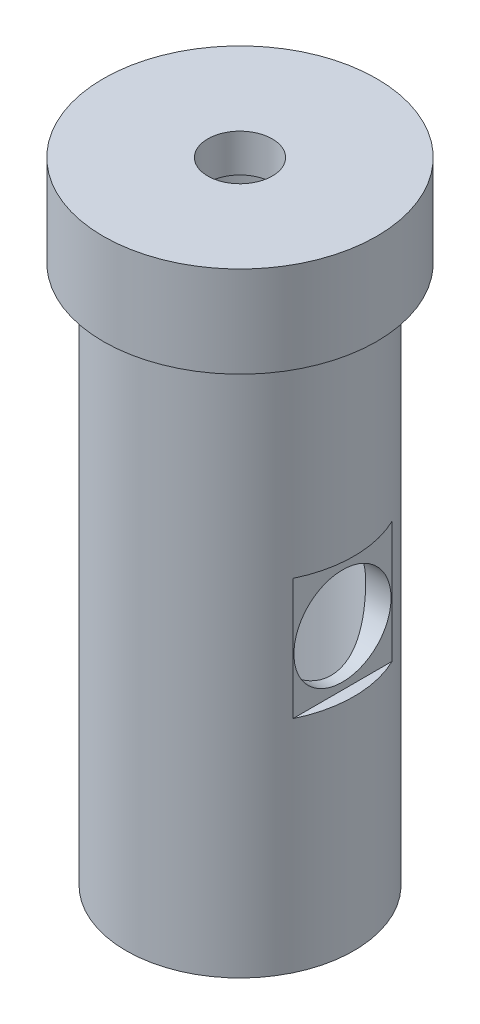
ISO-10303-21;
HEADER;
FILE_DESCRIPTION(('STEP AP214'),'2;1');
FILE_NAME('part.step','',(''),(''),'','','');
FILE_SCHEMA(('AUTOMOTIVE_DESIGN { 1 0 10303 214 1 1 1 1 }'));
ENDSEC;
DATA;
#1=APPLICATION_CONTEXT('core data for automotive mechanical design processes');
#2=APPLICATION_PROTOCOL_DEFINITION('international standard','automotive_design',2000,#1);
#3=PRODUCT_CONTEXT('',#1,'mechanical');
#4=PRODUCT('Part','Part','',(#3));
#5=PRODUCT_RELATED_PRODUCT_CATEGORY('part','',(#4));
#6=PRODUCT_DEFINITION_FORMATION('','',#4);
#7=PRODUCT_DEFINITION_CONTEXT('part definition',#1,'design');
#8=PRODUCT_DEFINITION('design','',#6,#7);
#9=PRODUCT_DEFINITION_SHAPE('','',#8);
#10=(LENGTH_UNIT() NAMED_UNIT(*) SI_UNIT(.MILLI.,.METRE.));
#11=(NAMED_UNIT(*) PLANE_ANGLE_UNIT() SI_UNIT($,.RADIAN.));
#12=(NAMED_UNIT(*) SI_UNIT($,.STERADIAN.) SOLID_ANGLE_UNIT());
#13=UNCERTAINTY_MEASURE_WITH_UNIT(LENGTH_MEASURE(1.E-05),#10,'distance_accuracy_value','');
#14=(GEOMETRIC_REPRESENTATION_CONTEXT(3) GLOBAL_UNCERTAINTY_ASSIGNED_CONTEXT((#13)) GLOBAL_UNIT_ASSIGNED_CONTEXT((#10,
#11,#12)) REPRESENTATION_CONTEXT('',''));
#15=CARTESIAN_POINT('',(0.,0.,0.));
#16=DIRECTION('',(0.,0.,1.));
#17=DIRECTION('',(1.,0.,0.));
#18=AXIS2_PLACEMENT_3D('',#15,#16,#17);
#19=CARTESIAN_POINT('',(0.,0.,0.));
#20=DIRECTION('',(0.,-1.,0.));
#21=DIRECTION('',(0.,0.,-1.));
#22=AXIS2_PLACEMENT_3D('',#19,#20,#21);
#23=CYLINDRICAL_SURFACE('',#22,15.);
#24=DIRECTION('',(0.,-1.,0.));
#25=VECTOR('',#24,1.);
#26=CARTESIAN_POINT('',(13.5,0.,6.53834841531101));
#27=LINE('',#26,#25);
#28=CARTESIAN_POINT('',(13.5,29.,6.53834841531101));
#29=VERTEX_POINT('',#28);
#30=CARTESIAN_POINT('',(13.5,45.,6.53834841531101));
#31=VERTEX_POINT('',#30);
#32=EDGE_CURVE('E48',#29,#31,#27,.F.);
#33=ORIENTED_EDGE('',*,*,#32,.T.);
#34=CARTESIAN_POINT('',(0.,45.,0.));
#35=DIRECTION('',(0.,1.,0.));
#36=DIRECTION('',(0.,0.,1.));
#37=AXIS2_PLACEMENT_3D('',#34,#35,#36);
#38=CIRCLE('',#37,15.);
#39=CARTESIAN_POINT('',(13.5,45.,-6.53834841531101));
#40=VERTEX_POINT('',#39);
#41=EDGE_CURVE('E54',#31,#40,#38,.T.);
#42=ORIENTED_EDGE('',*,*,#41,.T.);
#43=DIRECTION('',(0.,-1.,0.));
#44=VECTOR('',#43,1.);
#45=CARTESIAN_POINT('',(13.5,0.,-6.53834841531101));
#46=LINE('',#45,#44);
#47=CARTESIAN_POINT('',(13.5,29.,-6.53834841531101));
#48=VERTEX_POINT('',#47);
#49=EDGE_CURVE('E11',#40,#48,#46,.T.);
#50=ORIENTED_EDGE('',*,*,#49,.T.);
#51=CARTESIAN_POINT('',(0.,29.,0.));
#52=DIRECTION('',(0.,-1.,0.));
#53=DIRECTION('',(0.,0.,-1.));
#54=AXIS2_PLACEMENT_3D('',#51,#52,#53);
#55=CIRCLE('',#54,15.);
#56=EDGE_CURVE('E61',#48,#29,#55,.T.);
#57=ORIENTED_EDGE('',*,*,#56,.T.);
#58=EDGE_LOOP('',(#33,#42,#50,#57));
#59=FACE_BOUND('',#58,.T.);
#60=CARTESIAN_POINT('',(0.,0.,0.));
#61=DIRECTION('',(0.,-1.,0.));
#62=DIRECTION('',(0.,0.,-1.));
#63=AXIS2_PLACEMENT_3D('',#60,#61,#62);
#64=CIRCLE('',#63,15.);
#65=CARTESIAN_POINT('',(0.,0.,-15.));
#66=VERTEX_POINT('',#65);
#67=EDGE_CURVE('E80',#66,#66,#64,.T.);
#68=ORIENTED_EDGE('',*,*,#67,.F.);
#69=EDGE_LOOP('',(#68));
#70=FACE_BOUND('',#69,.T.);
#71=CARTESIAN_POINT('',(0.,71.,0.));
#72=DIRECTION('',(0.,-1.,0.));
#73=DIRECTION('',(0.,0.,-1.));
#74=AXIS2_PLACEMENT_3D('',#71,#72,#73);
#75=CIRCLE('',#74,15.);
#76=CARTESIAN_POINT('',(0.,71.,-15.));
#77=VERTEX_POINT('',#76);
#78=EDGE_CURVE('E75',#77,#77,#75,.T.);
#79=ORIENTED_EDGE('',*,*,#78,.T.);
#80=EDGE_LOOP('',(#79));
#81=FACE_BOUND('',#80,.T.);
#82=ADVANCED_FACE('F35',(#59,#70,#81),#23,.T.);
#83=CARTESIAN_POINT('',(-12.,0.,0.));
#84=DIRECTION('',(0.,1.,0.));
#85=DIRECTION('',(0.,0.,1.));
#86=AXIS2_PLACEMENT_3D('',#83,#84,#85);
#87=PLANE('',#86);
#88=CARTESIAN_POINT('',(0.,0.,0.));
#89=DIRECTION('',(0.,-1.,0.));
#90=DIRECTION('',(0.,0.,-1.));
#91=AXIS2_PLACEMENT_3D('',#88,#89,#90);
#92=CIRCLE('',#91,12.);
#93=CARTESIAN_POINT('',(0.,0.,-12.));
#94=VERTEX_POINT('',#93);
#95=EDGE_CURVE('E85',#94,#94,#92,.T.);
#96=ORIENTED_EDGE('',*,*,#95,.F.);
#97=EDGE_LOOP('',(#96));
#98=FACE_BOUND('',#97,.T.);
#99=ORIENTED_EDGE('',*,*,#67,.T.);
#100=EDGE_LOOP('',(#99));
#101=FACE_BOUND('',#100,.T.);
#102=ADVANCED_FACE('F126',(#98,#101),#87,.F.);
#103=CARTESIAN_POINT('',(0.,0.,0.));
#104=DIRECTION('',(0.,-1.,0.));
#105=DIRECTION('',(0.,0.,-1.));
#106=AXIS2_PLACEMENT_3D('',#103,#104,#105);
#107=CYLINDRICAL_SURFACE('',#106,12.);
#108=CARTESIAN_POINT('',(10.1508620323596,36.304872912084,-6.4));
#109=CARTESIAN_POINT('',(10.1508612250914,36.469897504109,-6.40000065688965));
#110=CARTESIAN_POINT('',(10.1548995801997,36.6349146976354,-6.39360937735728));
#111=CARTESIAN_POINT('',(10.1708905563061,36.9636408427246,-6.36814032039505));
#112=CARTESIAN_POINT('',(10.1828461537594,37.1273492788303,-6.34905777172223));
#113=CARTESIAN_POINT('',(10.2142266842615,37.4523154338643,-6.29844868721064));
#114=CARTESIAN_POINT('',(10.2336614176776,37.6135696474503,-6.26690582241812));
#115=CARTESIAN_POINT('',(10.27928629531,37.9323341897322,-6.19178496487026));
#116=CARTESIAN_POINT('',(10.3054794308007,38.0898428268327,-6.1482016423929));
#117=CARTESIAN_POINT('',(10.3635337605768,38.3990919866616,-6.04982663745212));
#118=CARTESIAN_POINT('',(10.3953575590964,38.5508630033311,-5.99510856640759));
#119=CARTESIAN_POINT('',(10.4638063692647,38.8489475184621,-5.87482320315679));
#120=CARTESIAN_POINT('',(10.5004332524046,38.9952588609027,-5.80925167934712));
#121=CARTESIAN_POINT('',(10.6159594170568,39.4249057746003,-5.59708024168359));
#122=CARTESIAN_POINT('',(10.7005551194711,39.6992099989998,-5.43494113504599));
#123=CARTESIAN_POINT('',(10.8850113678262,40.2438335445333,-5.0561826941529));
#124=CARTESIAN_POINT('',(10.9855589057498,40.5113209702699,-4.83586048330807));
#125=CARTESIAN_POINT('',(11.1851266185705,41.0079308189542,-4.35438996273654));
#126=CARTESIAN_POINT('',(11.2841459069956,41.2370316826465,-4.09321886896503));
#127=CARTESIAN_POINT('',(11.4282331622978,41.5560080412895,-3.66345207893257));
#128=CARTESIAN_POINT('',(11.4771780357429,41.661472148767,-3.50748864979899));
#129=CARTESIAN_POINT('',(11.5705645914663,41.8587475514409,-3.18590808402808));
#130=CARTESIAN_POINT('',(11.6150082217947,41.9505647608618,-3.0202951728061));
#131=CARTESIAN_POINT('',(11.6981088389304,42.1196098112658,-2.68045678869551));
#132=CARTESIAN_POINT('',(11.7367675515266,42.1968420051409,-2.50623390509706));
#133=CARTESIAN_POINT('',(11.8071505477965,42.3358262571922,-2.1503657703769));
#134=CARTESIAN_POINT('',(11.8388756888084,42.397580229394,-1.9687214402199));
#135=CARTESIAN_POINT('',(11.8921913624827,42.5005160584395,-1.61410890684681));
#136=CARTESIAN_POINT('',(11.9143851139318,42.5429389333849,-1.44159120842384));
#137=CARTESIAN_POINT('',(11.9514181388681,42.6133827145314,-1.09285845564876));
#138=CARTESIAN_POINT('',(11.9662577676928,42.6414043165776,-0.916643580366252));
#139=CARTESIAN_POINT('',(11.9881422305233,42.6826357960508,-0.56211291162343));
#140=CARTESIAN_POINT('',(11.9951916694973,42.6958544239327,-0.383798422372006));
#141=CARTESIAN_POINT('',(12.0012999130492,42.7073119073134,-0.0265571917399795));
#142=CARTESIAN_POINT('',(12.0003592988281,42.7055518523698,0.152369504161967));
#143=CARTESIAN_POINT('',(11.9910073876503,42.6879992494952,0.491550524796921));
#144=CARTESIAN_POINT('',(11.9833444977043,42.6736123994837,0.65190064939119));
#145=CARTESIAN_POINT('',(11.961741939071,42.6328717643205,0.970700822351116));
#146=CARTESIAN_POINT('',(11.9478001706843,42.6065139759812,1.1291502168878));
#147=CARTESIAN_POINT('',(11.9139745254727,42.5421429510751,1.44295171693833));
#148=CARTESIAN_POINT('',(11.8940927273828,42.5041337918272,1.59830488573308));
#149=CARTESIAN_POINT('',(11.8488327847678,42.4168472211565,1.90504895488573));
#150=CARTESIAN_POINT('',(11.8234524987002,42.3675654188634,2.05643828559099));
#151=CARTESIAN_POINT('',(11.7674336081332,42.2575833388881,2.35605484315131));
#152=CARTESIAN_POINT('',(11.7367376192634,42.1967576716284,2.5042252998329));
#153=CARTESIAN_POINT('',(11.6709565212511,42.0646037043558,2.79481754278228));
#154=CARTESIAN_POINT('',(11.6358699379592,41.9932718754511,2.93723737692617));
#155=CARTESIAN_POINT('',(11.5251085338001,41.7643649291036,3.35479071442533));
#156=CARTESIAN_POINT('',(11.4438967294316,41.591810983248,3.62039977037581));
#157=CARTESIAN_POINT('',(11.2642109922092,41.1913544860926,4.14765061686134));
#158=CARTESIAN_POINT('',(11.1648203607104,40.9595704973323,4.40603262410673));
#159=CARTESIAN_POINT('',(11.0150671954878,40.5832984994847,4.76288240889726));
#160=CARTESIAN_POINT('',(10.964997352703,40.4529910702378,4.87679175917765));
#161=CARTESIAN_POINT('',(10.8658372059405,40.1832943276237,5.09389841082923));
#162=CARTESIAN_POINT('',(10.8167470697921,40.0439034753667,5.19709388936434));
#163=CARTESIAN_POINT('',(10.7170241524822,39.7452168818533,5.39992330399592));
#164=CARTESIAN_POINT('',(10.6665798465543,39.5852199970025,5.4986191554548));
#165=CARTESIAN_POINT('',(10.5700390498139,39.2562175847098,5.68198985534254));
#166=CARTESIAN_POINT('',(10.5239406019371,39.0872161664535,5.7666710280886));
#167=CARTESIAN_POINT('',(10.437795316616,38.7411858708389,5.92116997672586));
#168=CARTESIAN_POINT('',(10.3977445677745,38.5641622790528,5.99099737146532));
#169=CARTESIAN_POINT('',(10.3253251543256,38.2031812542986,6.11496732754637));
#170=CARTESIAN_POINT('',(10.292955306435,38.0192248944266,6.16911230513081));
#171=CARTESIAN_POINT('',(10.2396453161967,37.6610114523281,6.25716349682107));
#172=CARTESIAN_POINT('',(10.2179914613783,37.487176592708,6.29235433372183));
#173=CARTESIAN_POINT('',(10.1833623632681,37.1363313510391,6.34824541973308));
#174=CARTESIAN_POINT('',(10.1703865862252,36.9593211649787,6.36894656004588));
#175=CARTESIAN_POINT('',(10.1537152142986,36.6038993688814,6.39549177457663));
#176=CARTESIAN_POINT('',(10.1500119335191,36.4254890425561,6.4013481535447));
#177=CARTESIAN_POINT('',(10.1520400582479,36.0688659309078,6.39813171686178));
#178=CARTESIAN_POINT('',(10.1577705882457,35.8906531287895,6.38906028659528));
#179=CARTESIAN_POINT('',(10.1770157220294,35.5597483118679,6.35835031830109));
#180=CARTESIAN_POINT('',(10.1893934361313,35.4068150041871,6.33854405721524));
#181=CARTESIAN_POINT('',(10.2206079839979,35.1033694463928,6.28808819532854));
#182=CARTESIAN_POINT('',(10.2394469100334,34.9528579970748,6.25743508199548));
#183=CARTESIAN_POINT('',(10.2829774173042,34.6552382445092,6.18563928831834));
#184=CARTESIAN_POINT('',(10.3076685829289,34.5081297004103,6.14449735284688));
#185=CARTESIAN_POINT('',(10.3621647715794,34.2180596446234,6.0521410814271));
#186=CARTESIAN_POINT('',(10.3919718060067,34.0750997900162,6.00092278260139));
#187=CARTESIAN_POINT('',(10.4906601901279,33.6411498020771,5.8278821843193));
#188=CARTESIAN_POINT('',(10.5668071248644,33.3580988937423,5.68981407184234));
#189=CARTESIAN_POINT('',(10.7300580231156,32.8176384283455,5.37560660791392));
#190=CARTESIAN_POINT('',(10.8171675515448,32.5602420139761,5.19944788777101));
#191=CARTESIAN_POINT('',(11.0079204657883,32.0385379693822,4.78386368604374));
#192=CARTESIAN_POINT('',(11.1121103489288,31.7787888049724,4.53894255266014));
#193=CARTESIAN_POINT('',(11.3145547581155,31.3022998270758,4.00767619218196));
#194=CARTESIAN_POINT('',(11.4128063218878,31.0855813578565,3.72131052874482));
#195=CARTESIAN_POINT('',(11.5502260850635,30.7934805063793,3.25879803055501));
#196=CARTESIAN_POINT('',(11.5951678274334,30.7000928373758,3.09548754456879));
#197=CARTESIAN_POINT('',(11.6795248348019,30.5275917278327,2.76016626525693));
#198=CARTESIAN_POINT('',(11.7189427236407,30.4484715050731,2.58815965580278));
#199=CARTESIAN_POINT('',(11.7910726903845,30.3054392697624,2.23669011469273));
#200=CARTESIAN_POINT('',(11.8237883905604,30.241519039191,2.05723127409081));
#201=CARTESIAN_POINT('',(11.8815241258604,30.1296875952094,1.69218981530048));
#202=CARTESIAN_POINT('',(11.9065452263741,30.0817741654284,1.50660804883207));
#203=CARTESIAN_POINT('',(11.9460241801504,30.0065867698716,1.14956944347703));
#204=CARTESIAN_POINT('',(11.9612819843756,29.9777402473222,0.978530792880211));
#205=CARTESIAN_POINT('',(11.9844722003774,29.9340079600462,0.634186331980352));
#206=CARTESIAN_POINT('',(11.9924051058222,29.9191212544843,0.460880675262719));
#207=CARTESIAN_POINT('',(12.0007202472023,29.9035191816852,0.113519707574125));
#208=CARTESIAN_POINT('',(12.001105400952,29.9027983382002,-0.0605352876887117));
#209=CARTESIAN_POINT('',(11.9943212193508,29.915524629606,-0.407974381434417));
#210=CARTESIAN_POINT('',(11.9871521972515,29.9289711770126,-0.581358507437229));
#211=CARTESIAN_POINT('',(11.9663491772235,29.9681733817817,-0.91194903781048));
#212=CARTESIAN_POINT('',(11.9532893328298,29.9928372160424,-1.06932283598669));
#213=CARTESIAN_POINT('',(11.9212702225113,30.0536847399578,-1.38127016173427));
#214=CARTESIAN_POINT('',(11.9023089699704,30.0898723089913,-1.53584272774452));
#215=CARTESIAN_POINT('',(11.8589240842397,30.1733680883053,-1.84110911502455));
#216=CARTESIAN_POINT('',(11.8345021493361,30.2206728413463,-1.99180412601092));
#217=CARTESIAN_POINT('',(11.7807148683267,30.3259691206232,-2.2885609538468));
#218=CARTESIAN_POINT('',(11.7513475964537,30.383964810861,-2.43462093933314));
#219=CARTESIAN_POINT('',(11.6871085161947,30.5124881659141,-2.72665840594574));
#220=CARTESIAN_POINT('',(11.6520722461043,30.5834025867469,-2.87242959493254));
#221=CARTESIAN_POINT('',(11.5780952909795,30.7356088152358,-3.15743907873034));
#222=CARTESIAN_POINT('',(11.5391532815317,30.8169041455682,-3.29667513386084));
#223=CARTESIAN_POINT('',(11.4176707406926,31.0754887902486,-3.70361773993523));
#224=CARTESIAN_POINT('',(11.3304399563728,31.2675422907278,-3.96070637870421));
#225=CARTESIAN_POINT('',(11.1404737914043,31.7098414480907,-4.46893466599772));
#226=CARTESIAN_POINT('',(11.037089639134,31.9641696998957,-4.71628823700337));
#227=CARTESIAN_POINT('',(10.8846257336238,32.3740767468386,-5.05373796728043));
#228=CARTESIAN_POINT('',(10.8341946753662,32.5155913711086,-5.1607072612426));
#229=CARTESIAN_POINT('',(10.735547639971,32.8076063300257,-5.36289556501423));
#230=CARTESIAN_POINT('',(10.6873320238066,32.9581081198754,-5.45811266421064));
#231=CARTESIAN_POINT('',(10.5920308523556,33.2757967423899,-5.64092993424401));
#232=CARTESIAN_POINT('',(10.5451492013389,33.4434458395738,-5.72783469113695));
#233=CARTESIAN_POINT('',(10.457168040451,33.7869571306435,-5.88692619657516));
#234=CARTESIAN_POINT('',(10.4160655704201,33.962815057937,-5.95912048855699));
#235=CARTESIAN_POINT('',(10.3413819225489,34.3212369853789,-6.08780333312895));
#236=CARTESIAN_POINT('',(10.3077821301869,34.5037830505199,-6.14433084186479));
#237=CARTESIAN_POINT('',(10.2495202180428,34.874449218814,-6.24103633808767));
#238=CARTESIAN_POINT('',(10.2248521854518,35.0625655448949,-6.28122514393904));
#239=CARTESIAN_POINT('',(10.1873975950769,35.4258079509785,-6.341772539591));
#240=CARTESIAN_POINT('',(10.1737509048883,35.6006053390416,-6.36357442819393));
#241=CARTESIAN_POINT('',(10.1554833851298,35.9518955669149,-6.39268808016555));
#242=CARTESIAN_POINT('',(10.1508628956872,36.1283884703639,-6.39999929749377));
#243=CARTESIAN_POINT('',(10.1508620323596,36.304872912084,-6.4));
#244=B_SPLINE_CURVE_WITH_KNOTS('',3,(#108,#109,#110,#111,#112,#113,#114,#115,#116,#117,#118,
#119,#120,#121,#122,#123,#124,#125,#126,#127,#128,#129,#130,#131,#132,#133,#134,#135,#136,#137,
#138,#139,#140,#141,#142,#143,#144,#145,#146,#147,#148,#149,#150,#151,#152,#153,#154,#155,#156,
#157,#158,#159,#160,#161,#162,#163,#164,#165,#166,#167,#168,#169,#170,#171,#172,#173,#174,#175,
#176,#177,#178,#179,#180,#181,#182,#183,#184,#185,#186,#187,#188,#189,#190,#191,#192,#193,#194,
#195,#196,#197,#198,#199,#200,#201,#202,#203,#204,#205,#206,#207,#208,#209,#210,#211,#212,#213,
#214,#215,#216,#217,#218,#219,#220,#221,#222,#223,#224,#225,#226,#227,#228,#229,#230,#231,#232,
#233,#234,#235,#236,#237,#238,#239,#240,#241,#242,#243),.UNSPECIFIED.,.T.,.F.,(4,2,2,2,2,2,2,2,
2,2,2,2,2,2,2,2,2,2,2,2,2,2,2,2,2,2,2,2,2,2,2,2,2,2,2,2,2,2,2,2,2,2,2,2,2,2,2,2,2,2,2,2,2,2,2,2,
2,2,2,2,2,2,2,2,2,2,2,4),(0.,0.494889927720015,0.989966013010644,1.48569304780212,
1.98163986928822,2.47440872214928,2.96737015293475,3.95248144709147,5.03078658166084,
6.10969531526173,6.69264847084676,7.27534824782696,7.85787384250525,8.44032736691114,
8.9767009100125,9.51304853401858,10.0490789402012,10.5850703555693,11.0680272891691,
11.5511458468927,12.0340955331589,12.5172336571719,13.0059558100702,13.4948424947382,
14.4720312246801,15.5504236311043,16.0904974051762,16.6306629162239,17.213845129295,
17.7967634514976,18.379303136848,18.9617530205431,19.4969976317896,20.032209319423,
20.5669772274178,21.101695508748,21.5652824419845,22.0290196359991,22.4927239064914,
22.9566109105656,23.924546947444,24.8929763323944,26.0039384466086,27.115450255821,
27.6950417173306,28.2743569318436,28.8533582183019,29.4322793004775,29.9539468975703,
30.4755793338445,30.9970101131567,31.5184192709684,31.9973582028814,32.4764585367438,
32.9554100759184,33.4345485570888,33.9315590314642,34.4287386127032,35.4226079515441,
36.5261350213987,37.0789155550993,37.631785839051,38.2147098524539,38.7973341895112,
39.3784965354928,39.9592734465871,40.4885102139277,41.0177669236989),.UNSPECIFIED.);
#245=CARTESIAN_POINT('',(10.1508620323596,36.304872912084,-6.4));
#246=VERTEX_POINT('',#245);
#247=EDGE_CURVE('E38',#246,#246,#244,.T.);
#248=ORIENTED_EDGE('',*,*,#247,.T.);
#249=EDGE_LOOP('',(#248));
#250=FACE_BOUND('',#249,.T.);
#251=CARTESIAN_POINT('',(0.,78.,0.));
#252=DIRECTION('',(0.,-1.,0.));
#253=DIRECTION('',(0.,0.,-1.));
#254=AXIS2_PLACEMENT_3D('',#251,#252,#253);
#255=CIRCLE('',#254,12.);
#256=CARTESIAN_POINT('',(0.,78.,-12.));
#257=VERTEX_POINT('',#256);
#258=EDGE_CURVE('E88',#257,#257,#255,.T.);
#259=ORIENTED_EDGE('',*,*,#258,.F.);
#260=EDGE_LOOP('',(#259));
#261=FACE_BOUND('',#260,.T.);
#262=ORIENTED_EDGE('',*,*,#95,.T.);
#263=EDGE_LOOP('',(#262));
#264=FACE_BOUND('',#263,.T.);
#265=ADVANCED_FACE('F113',(#250,#261,#264),#107,.F.);
#266=CARTESIAN_POINT('',(-4.25,78.,0.));
#267=DIRECTION('',(0.,1.,0.));
#268=DIRECTION('',(0.,0.,1.));
#269=AXIS2_PLACEMENT_3D('',#266,#267,#268);
#270=PLANE('',#269);
#271=CARTESIAN_POINT('',(0.,78.,0.));
#272=DIRECTION('',(0.,-1.,0.));
#273=DIRECTION('',(0.,0.,-1.));
#274=AXIS2_PLACEMENT_3D('',#271,#272,#273);
#275=CIRCLE('',#274,4.25);
#276=CARTESIAN_POINT('',(0.,78.,-4.25));
#277=VERTEX_POINT('',#276);
#278=EDGE_CURVE('E91',#277,#277,#275,.T.);
#279=ORIENTED_EDGE('',*,*,#278,.F.);
#280=EDGE_LOOP('',(#279));
#281=FACE_BOUND('',#280,.T.);
#282=ORIENTED_EDGE('',*,*,#258,.T.);
#283=EDGE_LOOP('',(#282));
#284=FACE_BOUND('',#283,.T.);
#285=ADVANCED_FACE('F134',(#281,#284),#270,.F.);
#286=CARTESIAN_POINT('',(0.,0.,0.));
#287=DIRECTION('',(0.,-1.,0.));
#288=DIRECTION('',(0.,0.,-1.));
#289=AXIS2_PLACEMENT_3D('',#286,#287,#288);
#290=CYLINDRICAL_SURFACE('',#289,4.25);
#291=CARTESIAN_POINT('',(0.,83.,0.));
#292=DIRECTION('',(0.,-1.,0.));
#293=DIRECTION('',(0.,0.,-1.));
#294=AXIS2_PLACEMENT_3D('',#291,#292,#293);
#295=CIRCLE('',#294,4.25);
#296=CARTESIAN_POINT('',(0.,83.,-4.25));
#297=VERTEX_POINT('',#296);
#298=EDGE_CURVE('E94',#297,#297,#295,.T.);
#299=ORIENTED_EDGE('',*,*,#298,.F.);
#300=EDGE_LOOP('',(#299));
#301=FACE_BOUND('',#300,.T.);
#302=ORIENTED_EDGE('',*,*,#278,.T.);
#303=EDGE_LOOP('',(#302));
#304=FACE_BOUND('',#303,.T.);
#305=ADVANCED_FACE('F141',(#301,#304),#290,.F.);
#306=CARTESIAN_POINT('',(-18.,83.,0.));
#307=DIRECTION('',(0.,-1.,0.));
#308=DIRECTION('',(0.,0.,-1.));
#309=AXIS2_PLACEMENT_3D('',#306,#307,#308);
#310=PLANE('',#309);
#311=CARTESIAN_POINT('',(0.,83.,0.));
#312=DIRECTION('',(0.,-1.,0.));
#313=DIRECTION('',(0.,0.,-1.));
#314=AXIS2_PLACEMENT_3D('',#311,#312,#313);
#315=CIRCLE('',#314,18.);
#316=CARTESIAN_POINT('',(0.,83.,-18.));
#317=VERTEX_POINT('',#316);
#318=EDGE_CURVE('E97',#317,#317,#315,.T.);
#319=ORIENTED_EDGE('',*,*,#318,.F.);
#320=EDGE_LOOP('',(#319));
#321=FACE_BOUND('',#320,.T.);
#322=ORIENTED_EDGE('',*,*,#298,.T.);
#323=EDGE_LOOP('',(#322));
#324=FACE_BOUND('',#323,.T.);
#325=ADVANCED_FACE('F145',(#321,#324),#310,.F.);
#326=CARTESIAN_POINT('',(0.,0.,0.));
#327=DIRECTION('',(0.,-1.,0.));
#328=DIRECTION('',(0.,0.,-1.));
#329=AXIS2_PLACEMENT_3D('',#326,#327,#328);
#330=CYLINDRICAL_SURFACE('',#329,18.);
#331=CARTESIAN_POINT('',(0.,71.,0.));
#332=DIRECTION('',(0.,-1.,0.));
#333=DIRECTION('',(0.,0.,-1.));
#334=AXIS2_PLACEMENT_3D('',#331,#332,#333);
#335=CIRCLE('',#334,18.);
#336=CARTESIAN_POINT('',(0.,71.,-18.));
#337=VERTEX_POINT('',#336);
#338=EDGE_CURVE('E100',#337,#337,#335,.T.);
#339=ORIENTED_EDGE('',*,*,#338,.F.);
#340=EDGE_LOOP('',(#339));
#341=FACE_BOUND('',#340,.T.);
#342=ORIENTED_EDGE('',*,*,#318,.T.);
#343=EDGE_LOOP('',(#342));
#344=FACE_BOUND('',#343,.T.);
#345=ADVANCED_FACE('F149',(#341,#344),#330,.T.);
#346=CARTESIAN_POINT('',(-15.,71.,0.));
#347=DIRECTION('',(0.,1.,0.));
#348=DIRECTION('',(0.,0.,1.));
#349=AXIS2_PLACEMENT_3D('',#346,#347,#348);
#350=PLANE('',#349);
#351=ORIENTED_EDGE('',*,*,#78,.F.);
#352=EDGE_LOOP('',(#351));
#353=FACE_BOUND('',#352,.T.);
#354=ORIENTED_EDGE('',*,*,#338,.T.);
#355=EDGE_LOOP('',(#354));
#356=FACE_BOUND('',#355,.T.);
#357=ADVANCED_FACE('F153',(#353,#356),#350,.F.);
#358=CARTESIAN_POINT('',(13.5,45.,-8.));
#359=DIRECTION('',(0.,1.,0.));
#360=DIRECTION('',(0.,0.,1.));
#361=AXIS2_PLACEMENT_3D('',#358,#359,#360);
#362=PLANE('',#361);
#363=DIRECTION('',(0.,0.,1.));
#364=VECTOR('',#363,1.);
#365=CARTESIAN_POINT('',(13.5,45.,-8.));
#366=LINE('',#365,#364);
#367=EDGE_CURVE('E70',#40,#31,#366,.T.);
#368=ORIENTED_EDGE('',*,*,#367,.F.);
#369=ORIENTED_EDGE('',*,*,#41,.F.);
#370=EDGE_LOOP('',(#368,#369));
#371=FACE_BOUND('',#370,.T.);
#372=ADVANCED_FACE('F74',(#371),#362,.F.);
#373=CARTESIAN_POINT('',(13.5,29.,-8.));
#374=DIRECTION('',(0.,-1.,0.));
#375=DIRECTION('',(0.,0.,-1.));
#376=AXIS2_PLACEMENT_3D('',#373,#374,#375);
#377=PLANE('',#376);
#378=DIRECTION('',(0.,0.,-1.));
#379=VECTOR('',#378,1.);
#380=CARTESIAN_POINT('',(13.5,29.,-8.));
#381=LINE('',#380,#379);
#382=EDGE_CURVE('E72',#29,#48,#381,.T.);
#383=ORIENTED_EDGE('',*,*,#382,.F.);
#384=ORIENTED_EDGE('',*,*,#56,.F.);
#385=EDGE_LOOP('',(#383,#384));
#386=FACE_BOUND('',#385,.T.);
#387=ADVANCED_FACE('F121',(#386),#377,.F.);
#388=CARTESIAN_POINT('',(13.5,0.,0.));
#389=DIRECTION('',(-1.,0.,0.));
#390=DIRECTION('',(0.,0.,1.));
#391=AXIS2_PLACEMENT_3D('',#388,#389,#390);
#392=PLANE('',#391);
#393=CARTESIAN_POINT('',(13.5,36.304872912084,0.));
#394=DIRECTION('',(1.,0.,0.));
#395=DIRECTION('',(0.,0.,-1.));
#396=AXIS2_PLACEMENT_3D('',#393,#394,#395);
#397=CIRCLE('',#396,6.4);
#398=CARTESIAN_POINT('',(13.5,36.304872912084,-6.4));
#399=VERTEX_POINT('',#398);
#400=EDGE_CURVE('E106',#399,#399,#397,.T.);
#401=ORIENTED_EDGE('',*,*,#400,.F.);
#402=EDGE_LOOP('',(#401));
#403=FACE_BOUND('',#402,.T.);
#404=ORIENTED_EDGE('',*,*,#367,.T.);
#405=ORIENTED_EDGE('',*,*,#32,.F.);
#406=ORIENTED_EDGE('',*,*,#382,.T.);
#407=ORIENTED_EDGE('',*,*,#49,.F.);
#408=EDGE_LOOP('',(#404,#405,#406,#407));
#409=FACE_BOUND('',#408,.T.);
#410=ADVANCED_FACE('F69',(#403,#409),#392,.F.);
#411=CARTESIAN_POINT('',(13.5,36.304872912084,0.));
#412=DIRECTION('',(1.,0.,0.));
#413=DIRECTION('',(0.,0.,-1.));
#414=AXIS2_PLACEMENT_3D('',#411,#412,#413);
#415=CYLINDRICAL_SURFACE('',#414,6.4);
#416=ORIENTED_EDGE('',*,*,#400,.T.);
#417=EDGE_LOOP('',(#416));
#418=FACE_BOUND('',#417,.T.);
#419=ORIENTED_EDGE('',*,*,#247,.F.);
#420=EDGE_LOOP('',(#419));
#421=FACE_BOUND('',#420,.T.);
#422=ADVANCED_FACE('F116',(#418,#421),#415,.F.);
#423=CLOSED_SHELL('',(#82,#102,#265,#285,#305,#325,#345,#357,#372,#387,#410,#422));
#424=MANIFOLD_SOLID_BREP('B2',#423);
#425=ADVANCED_BREP_SHAPE_REPRESENTATION('',(#18,#424),#14);
#426=SHAPE_DEFINITION_REPRESENTATION(#9,#425);
ENDSEC;
END-ISO-10303-21;
